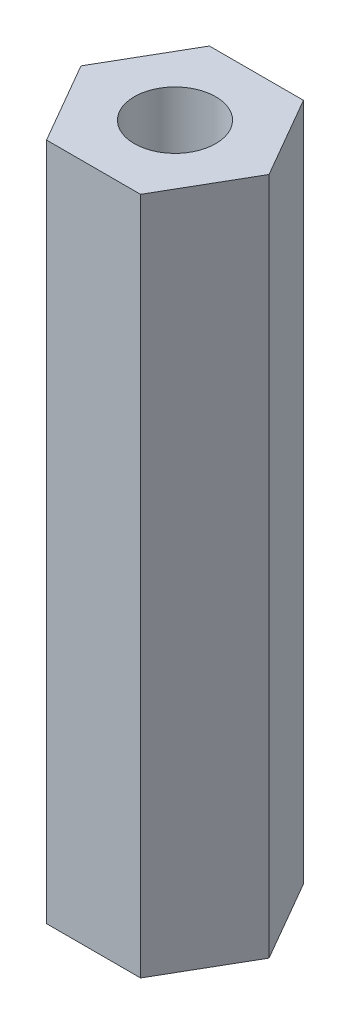
ISO-10303-21;
HEADER;
FILE_DESCRIPTION(('STEP AP214'),'2;1');
FILE_NAME('part.step','',(''),(''),'','','');
FILE_SCHEMA(('AUTOMOTIVE_DESIGN { 1 0 10303 214 1 1 1 1 }'));
ENDSEC;
DATA;
#1=APPLICATION_CONTEXT('core data for automotive mechanical design processes');
#2=APPLICATION_PROTOCOL_DEFINITION('international standard','automotive_design',2000,#1);
#3=PRODUCT_CONTEXT('',#1,'mechanical');
#4=PRODUCT('Part','Part','',(#3));
#5=PRODUCT_RELATED_PRODUCT_CATEGORY('part','',(#4));
#6=PRODUCT_DEFINITION_FORMATION('','',#4);
#7=PRODUCT_DEFINITION_CONTEXT('part definition',#1,'design');
#8=PRODUCT_DEFINITION('design','',#6,#7);
#9=PRODUCT_DEFINITION_SHAPE('','',#8);
#10=(LENGTH_UNIT() NAMED_UNIT(*) SI_UNIT(.MILLI.,.METRE.));
#11=(NAMED_UNIT(*) PLANE_ANGLE_UNIT() SI_UNIT($,.RADIAN.));
#12=(NAMED_UNIT(*) SI_UNIT($,.STERADIAN.) SOLID_ANGLE_UNIT());
#13=UNCERTAINTY_MEASURE_WITH_UNIT(LENGTH_MEASURE(1.E-05),#10,'distance_accuracy_value','');
#14=(GEOMETRIC_REPRESENTATION_CONTEXT(3) GLOBAL_UNCERTAINTY_ASSIGNED_CONTEXT((#13)) GLOBAL_UNIT_ASSIGNED_CONTEXT((#10,
#11,#12)) REPRESENTATION_CONTEXT('',''));
#15=CARTESIAN_POINT('',(0.,0.,0.));
#16=DIRECTION('',(0.,0.,1.));
#17=DIRECTION('',(1.,0.,0.));
#18=AXIS2_PLACEMENT_3D('',#15,#16,#17);
#19=CARTESIAN_POINT('',(-1.73205080756891,25.,-2.99999999999998));
#20=DIRECTION('',(0.866025403784441,0.,0.499999999999995));
#21=DIRECTION('',(0.499999999999995,0.,-0.866025403784442));
#22=AXIS2_PLACEMENT_3D('',#19,#20,#21);
#23=PLANE('',#22);
#24=DIRECTION('',(-0.499999999999995,0.,0.866025403784441));
#25=VECTOR('',#24,1.);
#26=CARTESIAN_POINT('',(-1.73205080756891,0.,-2.99999999999998));
#27=LINE('',#26,#25);
#28=CARTESIAN_POINT('',(-1.73205080756891,0.,-2.99999999999998));
#29=VERTEX_POINT('',#28);
#30=CARTESIAN_POINT('',(-3.46410161513775,0.,0.));
#31=VERTEX_POINT('',#30);
#32=EDGE_CURVE('E117',#29,#31,#27,.T.);
#33=ORIENTED_EDGE('',*,*,#32,.T.);
#34=DIRECTION('',(0.,-1.,0.));
#35=VECTOR('',#34,1.);
#36=CARTESIAN_POINT('',(-3.46410161513775,25.,0.));
#37=LINE('',#36,#35);
#38=CARTESIAN_POINT('',(-3.46410161513775,25.,0.));
#39=VERTEX_POINT('',#38);
#40=EDGE_CURVE('E11',#39,#31,#37,.T.);
#41=ORIENTED_EDGE('',*,*,#40,.F.);
#42=DIRECTION('',(-0.499999999999995,0.,0.866025403784441));
#43=VECTOR('',#42,1.);
#44=CARTESIAN_POINT('',(-1.73205080756891,25.,-2.99999999999998));
#45=LINE('',#44,#43);
#46=CARTESIAN_POINT('',(-1.73205080756891,25.,-2.99999999999998));
#47=VERTEX_POINT('',#46);
#48=EDGE_CURVE('E128',#47,#39,#45,.T.);
#49=ORIENTED_EDGE('',*,*,#48,.F.);
#50=DIRECTION('',(0.,-1.,0.));
#51=VECTOR('',#50,1.);
#52=CARTESIAN_POINT('',(-1.73205080756891,25.,-2.99999999999998));
#53=LINE('',#52,#51);
#54=EDGE_CURVE('E113',#47,#29,#53,.T.);
#55=ORIENTED_EDGE('',*,*,#54,.T.);
#56=EDGE_LOOP('',(#33,#41,#49,#55));
#57=FACE_BOUND('',#56,.T.);
#58=ADVANCED_FACE('F33',(#57),#23,.F.);
#59=CARTESIAN_POINT('',(-3.46410161513775,25.,0.));
#60=DIRECTION('',(0.866025403784438,0.,-0.500000000000001));
#61=DIRECTION('',(-0.500000000000001,0.,-0.866025403784438));
#62=AXIS2_PLACEMENT_3D('',#59,#60,#61);
#63=PLANE('',#62);
#64=DIRECTION('',(0.500000000000001,0.,0.866025403784438));
#65=VECTOR('',#64,1.);
#66=CARTESIAN_POINT('',(-3.46410161513775,0.,0.));
#67=LINE('',#66,#65);
#68=CARTESIAN_POINT('',(-1.73205080756887,0.,3.));
#69=VERTEX_POINT('',#68);
#70=EDGE_CURVE('E120',#31,#69,#67,.T.);
#71=ORIENTED_EDGE('',*,*,#70,.T.);
#72=DIRECTION('',(0.,-1.,0.));
#73=VECTOR('',#72,1.);
#74=CARTESIAN_POINT('',(-1.73205080756887,25.,3.));
#75=LINE('',#74,#73);
#76=CARTESIAN_POINT('',(-1.73205080756887,25.,3.));
#77=VERTEX_POINT('',#76);
#78=EDGE_CURVE('E41',#77,#69,#75,.T.);
#79=ORIENTED_EDGE('',*,*,#78,.F.);
#80=DIRECTION('',(0.500000000000001,0.,0.866025403784438));
#81=VECTOR('',#80,1.);
#82=CARTESIAN_POINT('',(-3.46410161513775,25.,0.));
#83=LINE('',#82,#81);
#84=EDGE_CURVE('E86',#39,#77,#83,.T.);
#85=ORIENTED_EDGE('',*,*,#84,.F.);
#86=ORIENTED_EDGE('',*,*,#40,.T.);
#87=EDGE_LOOP('',(#71,#79,#85,#86));
#88=FACE_BOUND('',#87,.T.);
#89=ADVANCED_FACE('F153',(#88),#63,.F.);
#90=CARTESIAN_POINT('',(-1.73205080756887,25.,3.));
#91=DIRECTION('',(0.,0.,-1.));
#92=DIRECTION('',(-1.,0.,0.));
#93=AXIS2_PLACEMENT_3D('',#90,#91,#92);
#94=PLANE('',#93);
#95=DIRECTION('',(1.,0.,0.));
#96=VECTOR('',#95,1.);
#97=CARTESIAN_POINT('',(-1.73205080756887,0.,3.));
#98=LINE('',#97,#96);
#99=CARTESIAN_POINT('',(1.73205080756889,0.,2.99999999999999));
#100=VERTEX_POINT('',#99);
#101=EDGE_CURVE('E123',#69,#100,#98,.T.);
#102=ORIENTED_EDGE('',*,*,#101,.T.);
#103=DIRECTION('',(0.,-1.,0.));
#104=VECTOR('',#103,1.);
#105=CARTESIAN_POINT('',(1.73205080756889,25.,2.99999999999999));
#106=LINE('',#105,#104);
#107=CARTESIAN_POINT('',(1.73205080756889,25.,2.99999999999999));
#108=VERTEX_POINT('',#107);
#109=EDGE_CURVE('E108',#108,#100,#106,.T.);
#110=ORIENTED_EDGE('',*,*,#109,.F.);
#111=DIRECTION('',(1.,0.,0.));
#112=VECTOR('',#111,1.);
#113=CARTESIAN_POINT('',(-1.73205080756887,25.,3.));
#114=LINE('',#113,#112);
#115=EDGE_CURVE('E99',#77,#108,#114,.T.);
#116=ORIENTED_EDGE('',*,*,#115,.F.);
#117=ORIENTED_EDGE('',*,*,#78,.T.);
#118=EDGE_LOOP('',(#102,#110,#116,#117));
#119=FACE_BOUND('',#118,.T.);
#120=ADVANCED_FACE('F134',(#119),#94,.F.);
#121=CARTESIAN_POINT('',(1.73205080756889,25.,2.99999999999999));
#122=DIRECTION('',(-0.866025403784442,0.,-0.499999999999995));
#123=DIRECTION('',(-0.499999999999995,0.,0.866025403784442));
#124=AXIS2_PLACEMENT_3D('',#121,#122,#123);
#125=PLANE('',#124);
#126=DIRECTION('',(0.499999999999995,0.,-0.866025403784442));
#127=VECTOR('',#126,1.);
#128=CARTESIAN_POINT('',(1.73205080756889,0.,2.99999999999999));
#129=LINE('',#128,#127);
#130=CARTESIAN_POINT('',(3.46410161513775,0.,0.));
#131=VERTEX_POINT('',#130);
#132=EDGE_CURVE('E107',#100,#131,#129,.T.);
#133=ORIENTED_EDGE('',*,*,#132,.T.);
#134=DIRECTION('',(0.,-1.,0.));
#135=VECTOR('',#134,1.);
#136=CARTESIAN_POINT('',(3.46410161513775,25.,0.));
#137=LINE('',#136,#135);
#138=CARTESIAN_POINT('',(3.46410161513775,25.,0.));
#139=VERTEX_POINT('',#138);
#140=EDGE_CURVE('E104',#139,#131,#137,.T.);
#141=ORIENTED_EDGE('',*,*,#140,.F.);
#142=DIRECTION('',(0.499999999999995,0.,-0.866025403784442));
#143=VECTOR('',#142,1.);
#144=CARTESIAN_POINT('',(1.73205080756889,25.,2.99999999999999));
#145=LINE('',#144,#143);
#146=EDGE_CURVE('E93',#108,#139,#145,.T.);
#147=ORIENTED_EDGE('',*,*,#146,.F.);
#148=ORIENTED_EDGE('',*,*,#109,.T.);
#149=EDGE_LOOP('',(#133,#141,#147,#148));
#150=FACE_BOUND('',#149,.T.);
#151=ADVANCED_FACE('F105',(#150),#125,.F.);
#152=CARTESIAN_POINT('',(3.46410161513775,25.,0.));
#153=DIRECTION('',(-0.866025403784434,0.,0.500000000000007));
#154=DIRECTION('',(0.500000000000007,0.,0.866025403784435));
#155=AXIS2_PLACEMENT_3D('',#152,#153,#154);
#156=PLANE('',#155);
#157=DIRECTION('',(-0.500000000000007,0.,-0.866025403784434));
#158=VECTOR('',#157,1.);
#159=CARTESIAN_POINT('',(3.46410161513775,0.,0.));
#160=LINE('',#159,#158);
#161=CARTESIAN_POINT('',(1.73205080756885,0.,-3.00000000000002));
#162=VERTEX_POINT('',#161);
#163=EDGE_CURVE('E72',#131,#162,#160,.T.);
#164=ORIENTED_EDGE('',*,*,#163,.T.);
#165=DIRECTION('',(0.,-1.,0.));
#166=VECTOR('',#165,1.);
#167=CARTESIAN_POINT('',(1.73205080756885,25.,-3.00000000000002));
#168=LINE('',#167,#166);
#169=CARTESIAN_POINT('',(1.73205080756885,25.,-3.00000000000002));
#170=VERTEX_POINT('',#169);
#171=EDGE_CURVE('E109',#170,#162,#168,.T.);
#172=ORIENTED_EDGE('',*,*,#171,.F.);
#173=DIRECTION('',(-0.500000000000007,0.,-0.866025403784434));
#174=VECTOR('',#173,1.);
#175=CARTESIAN_POINT('',(3.46410161513775,25.,0.));
#176=LINE('',#175,#174);
#177=EDGE_CURVE('E97',#139,#170,#176,.T.);
#178=ORIENTED_EDGE('',*,*,#177,.F.);
#179=ORIENTED_EDGE('',*,*,#140,.T.);
#180=EDGE_LOOP('',(#164,#172,#178,#179));
#181=FACE_BOUND('',#180,.T.);
#182=ADVANCED_FACE('F111',(#181),#156,.F.);
#183=CARTESIAN_POINT('',(1.73205080756885,25.,-3.00000000000002));
#184=DIRECTION('',(0.,0.,1.));
#185=DIRECTION('',(1.,0.,0.));
#186=AXIS2_PLACEMENT_3D('',#183,#184,#185);
#187=PLANE('',#186);
#188=DIRECTION('',(-1.,0.,0.));
#189=VECTOR('',#188,1.);
#190=CARTESIAN_POINT('',(1.73205080756885,0.,-3.00000000000002));
#191=LINE('',#190,#189);
#192=EDGE_CURVE('E78',#162,#29,#191,.T.);
#193=ORIENTED_EDGE('',*,*,#192,.T.);
#194=ORIENTED_EDGE('',*,*,#54,.F.);
#195=DIRECTION('',(-1.,0.,0.));
#196=VECTOR('',#195,1.);
#197=CARTESIAN_POINT('',(1.73205080756885,25.,-3.00000000000002));
#198=LINE('',#197,#196);
#199=EDGE_CURVE('E49',#170,#47,#198,.T.);
#200=ORIENTED_EDGE('',*,*,#199,.F.);
#201=ORIENTED_EDGE('',*,*,#171,.T.);
#202=EDGE_LOOP('',(#193,#194,#200,#201));
#203=FACE_BOUND('',#202,.T.);
#204=ADVANCED_FACE('F141',(#203),#187,.F.);
#205=CARTESIAN_POINT('',(0.,25.,0.));
#206=DIRECTION('',(0.,1.,0.));
#207=DIRECTION('',(0.,0.,1.));
#208=AXIS2_PLACEMENT_3D('',#205,#206,#207);
#209=PLANE('',#208);
#210=CARTESIAN_POINT('',(0.,25.,0.));
#211=DIRECTION('',(0.,1.,0.));
#212=DIRECTION('',(0.,0.,1.));
#213=AXIS2_PLACEMENT_3D('',#210,#211,#212);
#214=CIRCLE('',#213,1.5);
#215=CARTESIAN_POINT('',(0.,25.,1.5));
#216=VERTEX_POINT('',#215);
#217=EDGE_CURVE('E208',#216,#216,#214,.T.);
#218=ORIENTED_EDGE('',*,*,#217,.F.);
#219=EDGE_LOOP('',(#218));
#220=FACE_BOUND('',#219,.T.);
#221=ORIENTED_EDGE('',*,*,#48,.T.);
#222=ORIENTED_EDGE('',*,*,#84,.T.);
#223=ORIENTED_EDGE('',*,*,#115,.T.);
#224=ORIENTED_EDGE('',*,*,#146,.T.);
#225=ORIENTED_EDGE('',*,*,#177,.T.);
#226=ORIENTED_EDGE('',*,*,#199,.T.);
#227=EDGE_LOOP('',(#221,#222,#223,#224,#225,#226));
#228=FACE_BOUND('',#227,.T.);
#229=ADVANCED_FACE('F95',(#220,#228),#209,.T.);
#230=CARTESIAN_POINT('',(0.,0.,0.));
#231=DIRECTION('',(0.,1.,0.));
#232=DIRECTION('',(0.,0.,1.));
#233=AXIS2_PLACEMENT_3D('',#230,#231,#232);
#234=PLANE('',#233);
#235=CARTESIAN_POINT('',(0.,0.,0.));
#236=DIRECTION('',(0.,1.,0.));
#237=DIRECTION('',(0.,0.,1.));
#238=AXIS2_PLACEMENT_3D('',#235,#236,#237);
#239=CIRCLE('',#238,1.5);
#240=CARTESIAN_POINT('',(0.,0.,1.5));
#241=VERTEX_POINT('',#240);
#242=EDGE_CURVE('E121',#241,#241,#239,.T.);
#243=ORIENTED_EDGE('',*,*,#242,.T.);
#244=EDGE_LOOP('',(#243));
#245=FACE_BOUND('',#244,.T.);
#246=ORIENTED_EDGE('',*,*,#32,.F.);
#247=ORIENTED_EDGE('',*,*,#192,.F.);
#248=ORIENTED_EDGE('',*,*,#163,.F.);
#249=ORIENTED_EDGE('',*,*,#132,.F.);
#250=ORIENTED_EDGE('',*,*,#101,.F.);
#251=ORIENTED_EDGE('',*,*,#70,.F.);
#252=EDGE_LOOP('',(#246,#247,#248,#249,#250,#251));
#253=FACE_BOUND('',#252,.T.);
#254=ADVANCED_FACE('F137',(#245,#253),#234,.F.);
#255=CARTESIAN_POINT('',(0.,0.,0.));
#256=DIRECTION('',(0.,1.,0.));
#257=DIRECTION('',(0.,0.,1.));
#258=AXIS2_PLACEMENT_3D('',#255,#256,#257);
#259=CYLINDRICAL_SURFACE('',#258,1.5);
#260=ORIENTED_EDGE('',*,*,#242,.F.);
#261=EDGE_LOOP('',(#260));
#262=FACE_BOUND('',#261,.T.);
#263=ORIENTED_EDGE('',*,*,#217,.T.);
#264=EDGE_LOOP('',(#263));
#265=FACE_BOUND('',#264,.T.);
#266=ADVANCED_FACE('F190',(#262,#265),#259,.F.);
#267=CLOSED_SHELL('',(#58,#89,#120,#151,#182,#204,#229,#254,#266));
#268=MANIFOLD_SOLID_BREP('B2',#267);
#269=ADVANCED_BREP_SHAPE_REPRESENTATION('',(#18,#268),#14);
#270=SHAPE_DEFINITION_REPRESENTATION(#9,#269);
ENDSEC;
END-ISO-10303-21;
